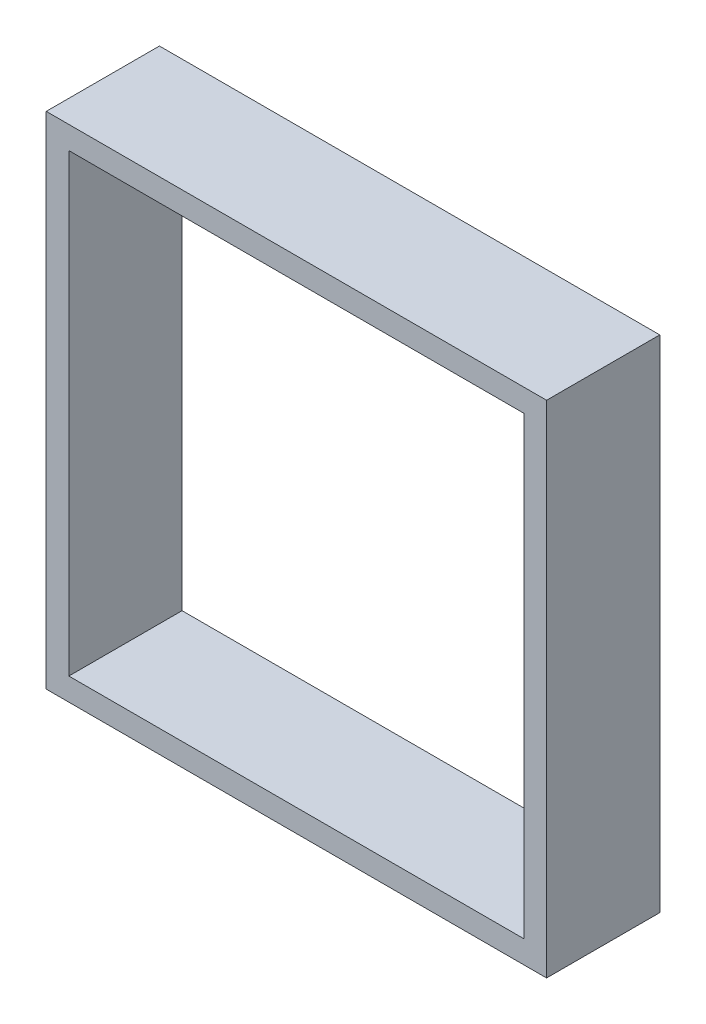
ISO-10303-21;
HEADER;
FILE_DESCRIPTION(('STEP AP214'),'2;1');
FILE_NAME('part.step','',(''),(''),'','','');
FILE_SCHEMA(('AUTOMOTIVE_DESIGN { 1 0 10303 214 1 1 1 1 }'));
ENDSEC;
DATA;
#1=APPLICATION_CONTEXT('core data for automotive mechanical design processes');
#2=APPLICATION_PROTOCOL_DEFINITION('international standard','automotive_design',2000,#1);
#3=PRODUCT_CONTEXT('',#1,'mechanical');
#4=PRODUCT('Part','Part','',(#3));
#5=PRODUCT_RELATED_PRODUCT_CATEGORY('part','',(#4));
#6=PRODUCT_DEFINITION_FORMATION('','',#4);
#7=PRODUCT_DEFINITION_CONTEXT('part definition',#1,'design');
#8=PRODUCT_DEFINITION('design','',#6,#7);
#9=PRODUCT_DEFINITION_SHAPE('','',#8);
#10=(LENGTH_UNIT() NAMED_UNIT(*) SI_UNIT(.MILLI.,.METRE.));
#11=(NAMED_UNIT(*) PLANE_ANGLE_UNIT() SI_UNIT($,.RADIAN.));
#12=(NAMED_UNIT(*) SI_UNIT($,.STERADIAN.) SOLID_ANGLE_UNIT());
#13=UNCERTAINTY_MEASURE_WITH_UNIT(LENGTH_MEASURE(1.E-05),#10,'distance_accuracy_value','');
#14=(GEOMETRIC_REPRESENTATION_CONTEXT(3) GLOBAL_UNCERTAINTY_ASSIGNED_CONTEXT((#13)) GLOBAL_UNIT_ASSIGNED_CONTEXT((#10,
#11,#12)) REPRESENTATION_CONTEXT('',''));
#15=CARTESIAN_POINT('',(0.,0.,0.));
#16=DIRECTION('',(0.,0.,1.));
#17=DIRECTION('',(1.,0.,0.));
#18=AXIS2_PLACEMENT_3D('',#15,#16,#17);
#19=CARTESIAN_POINT('',(0.,0.,10.));
#20=DIRECTION('',(0.,0.,1.));
#21=DIRECTION('',(1.,0.,0.));
#22=AXIS2_PLACEMENT_3D('',#19,#20,#21);
#23=PLANE('',#22);
#24=DIRECTION('',(0.,-1.,0.));
#25=VECTOR('',#24,1.);
#26=CARTESIAN_POINT('',(-47.2727272727279,13.7454545454542,10.));
#27=LINE('',#26,#25);
#28=CARTESIAN_POINT('',(-47.2727272727279,13.7454545454542,10.));
#29=VERTEX_POINT('',#28);
#30=CARTESIAN_POINT('',(-47.2727272727279,-30.4545454545459,10.));
#31=VERTEX_POINT('',#30);
#32=EDGE_CURVE('E140',#29,#31,#27,.T.);
#33=ORIENTED_EDGE('',*,*,#32,.T.);
#34=DIRECTION('',(1.,0.,0.));
#35=VECTOR('',#34,1.);
#36=CARTESIAN_POINT('',(-47.2727272727279,-30.4545454545459,10.));
#37=LINE('',#36,#35);
#38=CARTESIAN_POINT('',(-3.07272727272789,-30.4545454545459,10.));
#39=VERTEX_POINT('',#38);
#40=EDGE_CURVE('E143',#31,#39,#37,.T.);
#41=ORIENTED_EDGE('',*,*,#40,.T.);
#42=DIRECTION('',(0.,1.,0.));
#43=VECTOR('',#42,1.);
#44=CARTESIAN_POINT('',(-3.07272727272789,13.7454545454542,10.));
#45=LINE('',#44,#43);
#46=CARTESIAN_POINT('',(-3.07272727272789,13.7454545454542,10.));
#47=VERTEX_POINT('',#46);
#48=EDGE_CURVE('E146',#39,#47,#45,.T.);
#49=ORIENTED_EDGE('',*,*,#48,.T.);
#50=DIRECTION('',(-1.,0.,0.));
#51=VECTOR('',#50,1.);
#52=CARTESIAN_POINT('',(-47.2727272727279,13.7454545454542,10.));
#53=LINE('',#52,#51);
#54=EDGE_CURVE('E148',#47,#29,#53,.T.);
#55=ORIENTED_EDGE('',*,*,#54,.T.);
#56=EDGE_LOOP('',(#33,#41,#49,#55));
#57=FACE_BOUND('',#56,.T.);
#58=DIRECTION('',(1.,0.,0.));
#59=VECTOR('',#58,1.);
#60=CARTESIAN_POINT('',(-45.2727272727279,-28.4545454545458,10.));
#61=LINE('',#60,#59);
#62=CARTESIAN_POINT('',(-45.2727272727279,-28.4545454545458,10.));
#63=VERTEX_POINT('',#62);
#64=CARTESIAN_POINT('',(-5.07272727272789,-28.4545454545458,10.));
#65=VERTEX_POINT('',#64);
#66=EDGE_CURVE('E112',#63,#65,#61,.T.);
#67=ORIENTED_EDGE('',*,*,#66,.F.);
#68=DIRECTION('',(0.,-1.,0.));
#69=VECTOR('',#68,1.);
#70=CARTESIAN_POINT('',(-45.2727272727279,11.7454545454542,10.));
#71=LINE('',#70,#69);
#72=CARTESIAN_POINT('',(-45.2727272727279,11.7454545454542,10.));
#73=VERTEX_POINT('',#72);
#74=EDGE_CURVE('E104',#73,#63,#71,.T.);
#75=ORIENTED_EDGE('',*,*,#74,.F.);
#76=DIRECTION('',(-1.,0.,0.));
#77=VECTOR('',#76,1.);
#78=CARTESIAN_POINT('',(-45.2727272727279,11.7454545454542,10.));
#79=LINE('',#78,#77);
#80=CARTESIAN_POINT('',(-5.07272727272789,11.7454545454542,10.));
#81=VERTEX_POINT('',#80);
#82=EDGE_CURVE('E126',#81,#73,#79,.T.);
#83=ORIENTED_EDGE('',*,*,#82,.F.);
#84=DIRECTION('',(0.,1.,0.));
#85=VECTOR('',#84,1.);
#86=CARTESIAN_POINT('',(-5.07272727272789,11.7454545454542,10.));
#87=LINE('',#86,#85);
#88=EDGE_CURVE('E124',#65,#81,#87,.T.);
#89=ORIENTED_EDGE('',*,*,#88,.F.);
#90=EDGE_LOOP('',(#67,#75,#83,#89));
#91=FACE_BOUND('',#90,.T.);
#92=ADVANCED_FACE('F39',(#57,#91),#23,.T.);
#93=CARTESIAN_POINT('',(0.,0.,0.));
#94=DIRECTION('',(0.,0.,1.));
#95=DIRECTION('',(1.,0.,0.));
#96=AXIS2_PLACEMENT_3D('',#93,#94,#95);
#97=PLANE('',#96);
#98=DIRECTION('',(0.,-1.,0.));
#99=VECTOR('',#98,1.);
#100=CARTESIAN_POINT('',(-47.2727272727279,13.7454545454542,0.));
#101=LINE('',#100,#99);
#102=CARTESIAN_POINT('',(-47.2727272727279,13.7454545454542,0.));
#103=VERTEX_POINT('',#102);
#104=CARTESIAN_POINT('',(-47.2727272727279,-30.4545454545459,0.));
#105=VERTEX_POINT('',#104);
#106=EDGE_CURVE('E120',#103,#105,#101,.T.);
#107=ORIENTED_EDGE('',*,*,#106,.F.);
#108=DIRECTION('',(-1.,0.,0.));
#109=VECTOR('',#108,1.);
#110=CARTESIAN_POINT('',(-47.2727272727279,13.7454545454542,0.));
#111=LINE('',#110,#109);
#112=CARTESIAN_POINT('',(-3.07272727272789,13.7454545454542,0.));
#113=VERTEX_POINT('',#112);
#114=EDGE_CURVE('E144',#113,#103,#111,.T.);
#115=ORIENTED_EDGE('',*,*,#114,.F.);
#116=DIRECTION('',(0.,1.,0.));
#117=VECTOR('',#116,1.);
#118=CARTESIAN_POINT('',(-3.07272727272789,13.7454545454542,0.));
#119=LINE('',#118,#117);
#120=CARTESIAN_POINT('',(-3.07272727272789,-30.4545454545459,0.));
#121=VERTEX_POINT('',#120);
#122=EDGE_CURVE('E155',#121,#113,#119,.T.);
#123=ORIENTED_EDGE('',*,*,#122,.F.);
#124=DIRECTION('',(1.,0.,0.));
#125=VECTOR('',#124,1.);
#126=CARTESIAN_POINT('',(-47.2727272727279,-30.4545454545459,0.));
#127=LINE('',#126,#125);
#128=EDGE_CURVE('E153',#105,#121,#127,.T.);
#129=ORIENTED_EDGE('',*,*,#128,.F.);
#130=EDGE_LOOP('',(#107,#115,#123,#129));
#131=FACE_BOUND('',#130,.T.);
#132=DIRECTION('',(0.,-1.,0.));
#133=VECTOR('',#132,1.);
#134=CARTESIAN_POINT('',(-45.2727272727279,11.7454545454542,0.));
#135=LINE('',#134,#133);
#136=CARTESIAN_POINT('',(-45.2727272727279,11.7454545454542,0.));
#137=VERTEX_POINT('',#136);
#138=CARTESIAN_POINT('',(-45.2727272727279,-28.4545454545458,0.));
#139=VERTEX_POINT('',#138);
#140=EDGE_CURVE('E62',#137,#139,#135,.T.);
#141=ORIENTED_EDGE('',*,*,#140,.T.);
#142=DIRECTION('',(1.,0.,0.));
#143=VECTOR('',#142,1.);
#144=CARTESIAN_POINT('',(-45.2727272727279,-28.4545454545458,0.));
#145=LINE('',#144,#143);
#146=CARTESIAN_POINT('',(-5.07272727272789,-28.4545454545458,0.));
#147=VERTEX_POINT('',#146);
#148=EDGE_CURVE('E119',#139,#147,#145,.T.);
#149=ORIENTED_EDGE('',*,*,#148,.T.);
#150=DIRECTION('',(0.,1.,0.));
#151=VECTOR('',#150,1.);
#152=CARTESIAN_POINT('',(-5.07272727272789,11.7454545454542,0.));
#153=LINE('',#152,#151);
#154=CARTESIAN_POINT('',(-5.07272727272789,11.7454545454542,0.));
#155=VERTEX_POINT('',#154);
#156=EDGE_CURVE('E132',#147,#155,#153,.T.);
#157=ORIENTED_EDGE('',*,*,#156,.T.);
#158=DIRECTION('',(-1.,0.,0.));
#159=VECTOR('',#158,1.);
#160=CARTESIAN_POINT('',(-45.2727272727279,11.7454545454542,0.));
#161=LINE('',#160,#159);
#162=EDGE_CURVE('E113',#155,#137,#161,.T.);
#163=ORIENTED_EDGE('',*,*,#162,.T.);
#164=EDGE_LOOP('',(#141,#149,#157,#163));
#165=FACE_BOUND('',#164,.T.);
#166=ADVANCED_FACE('F173',(#131,#165),#97,.F.);
#167=CARTESIAN_POINT('',(-47.2727272727279,13.7454545454542,10.));
#168=DIRECTION('',(1.,0.,0.));
#169=DIRECTION('',(0.,1.,0.));
#170=AXIS2_PLACEMENT_3D('',#167,#168,#169);
#171=PLANE('',#170);
#172=ORIENTED_EDGE('',*,*,#106,.T.);
#173=DIRECTION('',(0.,0.,-1.));
#174=VECTOR('',#173,1.);
#175=CARTESIAN_POINT('',(-47.2727272727279,-30.4545454545459,10.));
#176=LINE('',#175,#174);
#177=EDGE_CURVE('E11',#31,#105,#176,.T.);
#178=ORIENTED_EDGE('',*,*,#177,.F.);
#179=ORIENTED_EDGE('',*,*,#32,.F.);
#180=DIRECTION('',(0.,0.,-1.));
#181=VECTOR('',#180,1.);
#182=CARTESIAN_POINT('',(-47.2727272727279,13.7454545454542,10.));
#183=LINE('',#182,#181);
#184=EDGE_CURVE('E150',#29,#103,#183,.T.);
#185=ORIENTED_EDGE('',*,*,#184,.T.);
#186=EDGE_LOOP('',(#172,#178,#179,#185));
#187=FACE_BOUND('',#186,.T.);
#188=ADVANCED_FACE('F41',(#187),#171,.F.);
#189=CARTESIAN_POINT('',(-47.2727272727279,-30.4545454545459,10.));
#190=DIRECTION('',(0.,1.,0.));
#191=DIRECTION('',(0.,0.,1.));
#192=AXIS2_PLACEMENT_3D('',#189,#190,#191);
#193=PLANE('',#192);
#194=ORIENTED_EDGE('',*,*,#128,.T.);
#195=DIRECTION('',(0.,0.,-1.));
#196=VECTOR('',#195,1.);
#197=CARTESIAN_POINT('',(-3.07272727272789,-30.4545454545459,10.));
#198=LINE('',#197,#196);
#199=EDGE_CURVE('E47',#39,#121,#198,.T.);
#200=ORIENTED_EDGE('',*,*,#199,.F.);
#201=ORIENTED_EDGE('',*,*,#40,.F.);
#202=ORIENTED_EDGE('',*,*,#177,.T.);
#203=EDGE_LOOP('',(#194,#200,#201,#202));
#204=FACE_BOUND('',#203,.T.);
#205=ADVANCED_FACE('F183',(#204),#193,.F.);
#206=CARTESIAN_POINT('',(-3.07272727272789,13.7454545454542,10.));
#207=DIRECTION('',(-1.,0.,0.));
#208=DIRECTION('',(0.,-1.,0.));
#209=AXIS2_PLACEMENT_3D('',#206,#207,#208);
#210=PLANE('',#209);
#211=ORIENTED_EDGE('',*,*,#122,.T.);
#212=DIRECTION('',(0.,0.,-1.));
#213=VECTOR('',#212,1.);
#214=CARTESIAN_POINT('',(-3.07272727272789,13.7454545454542,10.));
#215=LINE('',#214,#213);
#216=EDGE_CURVE('E160',#47,#113,#215,.T.);
#217=ORIENTED_EDGE('',*,*,#216,.F.);
#218=ORIENTED_EDGE('',*,*,#48,.F.);
#219=ORIENTED_EDGE('',*,*,#199,.T.);
#220=EDGE_LOOP('',(#211,#217,#218,#219));
#221=FACE_BOUND('',#220,.T.);
#222=ADVANCED_FACE('F167',(#221),#210,.F.);
#223=CARTESIAN_POINT('',(-47.2727272727279,13.7454545454542,10.));
#224=DIRECTION('',(0.,-1.,0.));
#225=DIRECTION('',(0.,0.,-1.));
#226=AXIS2_PLACEMENT_3D('',#223,#224,#225);
#227=PLANE('',#226);
#228=ORIENTED_EDGE('',*,*,#114,.T.);
#229=ORIENTED_EDGE('',*,*,#184,.F.);
#230=ORIENTED_EDGE('',*,*,#54,.F.);
#231=ORIENTED_EDGE('',*,*,#216,.T.);
#232=EDGE_LOOP('',(#228,#229,#230,#231));
#233=FACE_BOUND('',#232,.T.);
#234=ADVANCED_FACE('F177',(#233),#227,.F.);
#235=CARTESIAN_POINT('',(-45.2727272727279,11.7454545454542,10.));
#236=DIRECTION('',(1.,0.,0.));
#237=DIRECTION('',(0.,0.,-1.));
#238=AXIS2_PLACEMENT_3D('',#235,#236,#237);
#239=PLANE('',#238);
#240=ORIENTED_EDGE('',*,*,#140,.F.);
#241=DIRECTION('',(0.,0.,-1.));
#242=VECTOR('',#241,1.);
#243=CARTESIAN_POINT('',(-45.2727272727279,11.7454545454542,10.));
#244=LINE('',#243,#242);
#245=EDGE_CURVE('E108',#73,#137,#244,.T.);
#246=ORIENTED_EDGE('',*,*,#245,.F.);
#247=ORIENTED_EDGE('',*,*,#74,.T.);
#248=DIRECTION('',(0.,0.,-1.));
#249=VECTOR('',#248,1.);
#250=CARTESIAN_POINT('',(-45.2727272727279,-28.4545454545458,10.));
#251=LINE('',#250,#249);
#252=EDGE_CURVE('E107',#63,#139,#251,.T.);
#253=ORIENTED_EDGE('',*,*,#252,.T.);
#254=EDGE_LOOP('',(#240,#246,#247,#253));
#255=FACE_BOUND('',#254,.T.);
#256=ADVANCED_FACE('F106',(#255),#239,.T.);
#257=CARTESIAN_POINT('',(-45.2727272727279,-28.4545454545458,10.));
#258=DIRECTION('',(0.,1.,0.));
#259=DIRECTION('',(0.,0.,1.));
#260=AXIS2_PLACEMENT_3D('',#257,#258,#259);
#261=PLANE('',#260);
#262=ORIENTED_EDGE('',*,*,#148,.F.);
#263=ORIENTED_EDGE('',*,*,#252,.F.);
#264=ORIENTED_EDGE('',*,*,#66,.T.);
#265=DIRECTION('',(0.,0.,-1.));
#266=VECTOR('',#265,1.);
#267=CARTESIAN_POINT('',(-5.07272727272789,-28.4545454545458,10.));
#268=LINE('',#267,#266);
#269=EDGE_CURVE('E121',#65,#147,#268,.T.);
#270=ORIENTED_EDGE('',*,*,#269,.T.);
#271=EDGE_LOOP('',(#262,#263,#264,#270));
#272=FACE_BOUND('',#271,.T.);
#273=ADVANCED_FACE('F116',(#272),#261,.T.);
#274=CARTESIAN_POINT('',(-5.07272727272789,11.7454545454542,10.));
#275=DIRECTION('',(-1.,0.,0.));
#276=DIRECTION('',(0.,-1.,0.));
#277=AXIS2_PLACEMENT_3D('',#274,#275,#276);
#278=PLANE('',#277);
#279=ORIENTED_EDGE('',*,*,#156,.F.);
#280=ORIENTED_EDGE('',*,*,#269,.F.);
#281=ORIENTED_EDGE('',*,*,#88,.T.);
#282=DIRECTION('',(0.,0.,-1.));
#283=VECTOR('',#282,1.);
#284=CARTESIAN_POINT('',(-5.07272727272789,11.7454545454542,10.));
#285=LINE('',#284,#283);
#286=EDGE_CURVE('E54',#81,#155,#285,.T.);
#287=ORIENTED_EDGE('',*,*,#286,.T.);
#288=EDGE_LOOP('',(#279,#280,#281,#287));
#289=FACE_BOUND('',#288,.T.);
#290=ADVANCED_FACE('F206',(#289),#278,.T.);
#291=CARTESIAN_POINT('',(-45.2727272727279,11.7454545454542,10.));
#292=DIRECTION('',(0.,-1.,0.));
#293=DIRECTION('',(0.,0.,-1.));
#294=AXIS2_PLACEMENT_3D('',#291,#292,#293);
#295=PLANE('',#294);
#296=ORIENTED_EDGE('',*,*,#162,.F.);
#297=ORIENTED_EDGE('',*,*,#286,.F.);
#298=ORIENTED_EDGE('',*,*,#82,.T.);
#299=ORIENTED_EDGE('',*,*,#245,.T.);
#300=EDGE_LOOP('',(#296,#297,#298,#299));
#301=FACE_BOUND('',#300,.T.);
#302=ADVANCED_FACE('F210',(#301),#295,.T.);
#303=CLOSED_SHELL('',(#92,#166,#188,#205,#222,#234,#256,#273,#290,#302));
#304=MANIFOLD_SOLID_BREP('B2',#303);
#305=ADVANCED_BREP_SHAPE_REPRESENTATION('',(#18,#304),#14);
#306=SHAPE_DEFINITION_REPRESENTATION(#9,#305);
ENDSEC;
END-ISO-10303-21;
